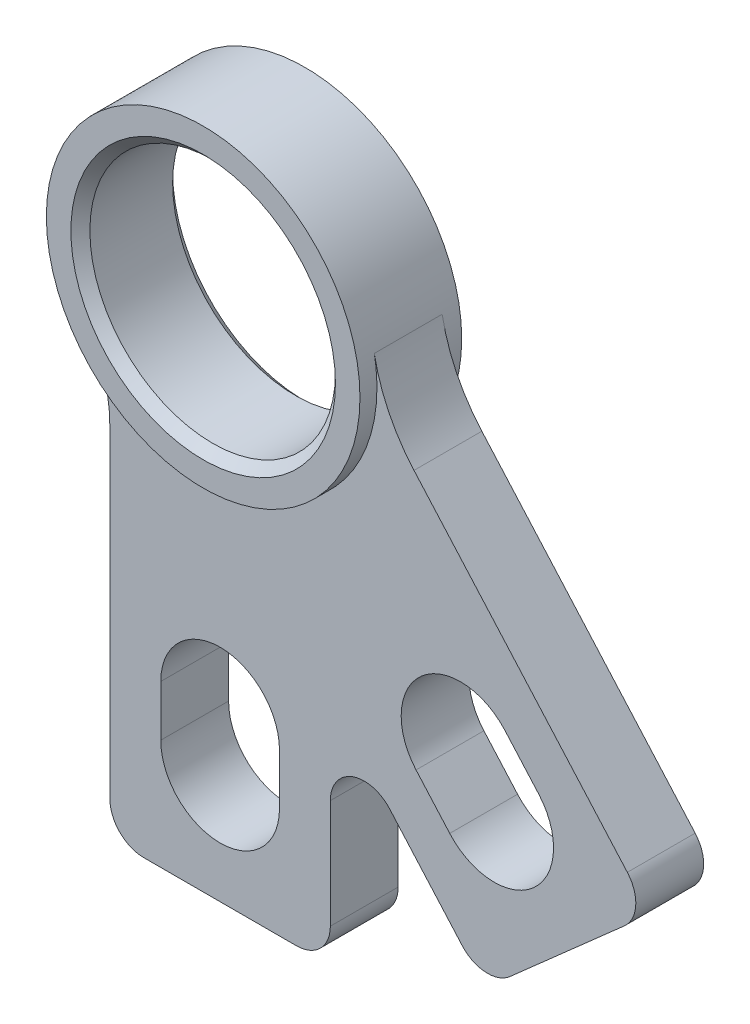
ISO-10303-21;
HEADER;
FILE_DESCRIPTION(('STEP AP214'),'2;1');
FILE_NAME('part.step','',(''),(''),'','','');
FILE_SCHEMA(('AUTOMOTIVE_DESIGN { 1 0 10303 214 1 1 1 1 }'));
ENDSEC;
DATA;
#1=APPLICATION_CONTEXT('core data for automotive mechanical design processes');
#2=APPLICATION_PROTOCOL_DEFINITION('international standard','automotive_design',2000,#1);
#3=PRODUCT_CONTEXT('',#1,'mechanical');
#4=PRODUCT('Part','Part','',(#3));
#5=PRODUCT_RELATED_PRODUCT_CATEGORY('part','',(#4));
#6=PRODUCT_DEFINITION_FORMATION('','',#4);
#7=PRODUCT_DEFINITION_CONTEXT('part definition',#1,'design');
#8=PRODUCT_DEFINITION('design','',#6,#7);
#9=PRODUCT_DEFINITION_SHAPE('','',#8);
#10=(LENGTH_UNIT() NAMED_UNIT(*) SI_UNIT(.MILLI.,.METRE.));
#11=(NAMED_UNIT(*) PLANE_ANGLE_UNIT() SI_UNIT($,.RADIAN.));
#12=(NAMED_UNIT(*) SI_UNIT($,.STERADIAN.) SOLID_ANGLE_UNIT());
#13=UNCERTAINTY_MEASURE_WITH_UNIT(LENGTH_MEASURE(1.E-05),#10,'distance_accuracy_value','');
#14=(GEOMETRIC_REPRESENTATION_CONTEXT(3) GLOBAL_UNCERTAINTY_ASSIGNED_CONTEXT((#13)) GLOBAL_UNIT_ASSIGNED_CONTEXT((#10,
#11,#12)) REPRESENTATION_CONTEXT('',''));
#15=CARTESIAN_POINT('',(0.,0.,0.));
#16=DIRECTION('',(0.,0.,1.));
#17=DIRECTION('',(1.,0.,0.));
#18=AXIS2_PLACEMENT_3D('',#15,#16,#17);
#19=CARTESIAN_POINT('',(0.,0.,4.7625));
#20=DIRECTION('',(0.,0.,-1.));
#21=DIRECTION('',(-1.,0.,0.));
#22=AXIS2_PLACEMENT_3D('',#19,#20,#21);
#23=CYLINDRICAL_SURFACE('',#22,11.495405);
#24=CARTESIAN_POINT('',(0.,0.,3.87349999999999));
#25=DIRECTION('',(0.,0.,1.));
#26=DIRECTION('',(1.,0.,0.));
#27=AXIS2_PLACEMENT_3D('',#24,#25,#26);
#28=CIRCLE('',#27,11.495405);
#29=CARTESIAN_POINT('',(-11.495405,0.,3.87349999999999));
#30=VERTEX_POINT('',#29);
#31=EDGE_CURVE('E376',#30,#30,#28,.T.);
#32=CARTESIAN_POINT('',(0.,0.,-3.87350000000005));
#33=DIRECTION('',(0.,0.,1.));
#34=DIRECTION('',(1.,0.,0.));
#35=AXIS2_PLACEMENT_3D('',#32,#33,#34);
#36=CIRCLE('',#35,11.495405);
#37=CARTESIAN_POINT('',(-11.495405,0.,-3.87350000000005));
#38=VERTEX_POINT('',#37);
#39=EDGE_CURVE('E373',#38,#38,#36,.F.);
#40=CARTESIAN_POINT('',(-11.495405,0.,3.87349999999999));
#41=CARTESIAN_POINT('',(-11.495405,0.,3.79280208333332));
#42=CARTESIAN_POINT('',(-11.495405,0.,3.71210416666666));
#43=CARTESIAN_POINT('',(-11.495405,0.,3.55070833333332));
#44=CARTESIAN_POINT('',(-11.495405,0.,3.47001041666665));
#45=CARTESIAN_POINT('',(-11.495405,0.,3.30861458333332));
#46=CARTESIAN_POINT('',(-11.495405,0.,3.22791666666665));
#47=CARTESIAN_POINT('',(-11.495405,0.,3.06652083333332));
#48=CARTESIAN_POINT('',(-11.495405,0.,2.98582291666665));
#49=CARTESIAN_POINT('',(-11.495405,0.,2.82442708333332));
#50=CARTESIAN_POINT('',(-11.495405,0.,2.74372916666665));
#51=CARTESIAN_POINT('',(-11.495405,0.,2.58233333333332));
#52=CARTESIAN_POINT('',(-11.495405,0.,2.50163541666665));
#53=CARTESIAN_POINT('',(-11.495405,0.,2.34023958333332));
#54=CARTESIAN_POINT('',(-11.495405,0.,2.25954166666665));
#55=CARTESIAN_POINT('',(-11.495405,0.,2.09814583333331));
#56=CARTESIAN_POINT('',(-11.495405,0.,2.01744791666665));
#57=CARTESIAN_POINT('',(-11.495405,0.,1.85605208333331));
#58=CARTESIAN_POINT('',(-11.495405,0.,1.77535416666665));
#59=CARTESIAN_POINT('',(-11.495405,0.,1.61395833333331));
#60=CARTESIAN_POINT('',(-11.495405,0.,1.53326041666664));
#61=CARTESIAN_POINT('',(-11.495405,0.,1.37186458333331));
#62=CARTESIAN_POINT('',(-11.495405,0.,1.29116666666664));
#63=CARTESIAN_POINT('',(-11.495405,0.,1.12977083333331));
#64=CARTESIAN_POINT('',(-11.495405,0.,1.04907291666664));
#65=CARTESIAN_POINT('',(-11.495405,0.,0.887677083333308));
#66=CARTESIAN_POINT('',(-11.495405,0.,0.80697916666664));
#67=CARTESIAN_POINT('',(-11.495405,0.,0.645583333333307));
#68=CARTESIAN_POINT('',(-11.495405,0.,0.564885416666639));
#69=CARTESIAN_POINT('',(-11.495405,0.,0.403489583333305));
#70=CARTESIAN_POINT('',(-11.495405,0.,0.322791666666638));
#71=CARTESIAN_POINT('',(-11.495405,0.,0.161395833333303));
#72=CARTESIAN_POINT('',(-11.495405,0.,0.080697916666636));
#73=CARTESIAN_POINT('',(-11.495405,0.,-0.0806979166666979));
#74=CARTESIAN_POINT('',(-11.495405,0.,-0.161395833333365));
#75=CARTESIAN_POINT('',(-11.495405,0.,-0.322791666666699));
#76=CARTESIAN_POINT('',(-11.495405,0.,-0.403489583333366));
#77=CARTESIAN_POINT('',(-11.495405,0.,-0.5648854166667));
#78=CARTESIAN_POINT('',(-11.495405,0.,-0.645583333333368));
#79=CARTESIAN_POINT('',(-11.495405,0.,-0.806979166666702));
#80=CARTESIAN_POINT('',(-11.495405,0.,-0.88767708333337));
#81=CARTESIAN_POINT('',(-11.495405,0.,-1.0490729166667));
#82=CARTESIAN_POINT('',(-11.495405,0.,-1.12977083333337));
#83=CARTESIAN_POINT('',(-11.495405,0.,-1.2911666666667));
#84=CARTESIAN_POINT('',(-11.495405,0.,-1.37186458333337));
#85=CARTESIAN_POINT('',(-11.495405,0.,-1.53326041666671));
#86=CARTESIAN_POINT('',(-11.495405,0.,-1.61395833333337));
#87=CARTESIAN_POINT('',(-11.495405,0.,-1.77535416666671));
#88=CARTESIAN_POINT('',(-11.495405,0.,-1.85605208333337));
#89=CARTESIAN_POINT('',(-11.495405,0.,-2.01744791666671));
#90=CARTESIAN_POINT('',(-11.495405,0.,-2.09814583333338));
#91=CARTESIAN_POINT('',(-11.495405,0.,-2.25954166666671));
#92=CARTESIAN_POINT('',(-11.495405,0.,-2.34023958333338));
#93=CARTESIAN_POINT('',(-11.495405,0.,-2.50163541666671));
#94=CARTESIAN_POINT('',(-11.495405,0.,-2.58233333333338));
#95=CARTESIAN_POINT('',(-11.495405,0.,-2.74372916666671));
#96=CARTESIAN_POINT('',(-11.495405,0.,-2.82442708333338));
#97=CARTESIAN_POINT('',(-11.495405,0.,-2.98582291666671));
#98=CARTESIAN_POINT('',(-11.495405,0.,-3.06652083333338));
#99=CARTESIAN_POINT('',(-11.495405,0.,-3.22791666666671));
#100=CARTESIAN_POINT('',(-11.495405,0.,-3.30861458333338));
#101=CARTESIAN_POINT('',(-11.495405,0.,-3.47001041666672));
#102=CARTESIAN_POINT('',(-11.495405,0.,-3.55070833333338));
#103=CARTESIAN_POINT('',(-11.495405,0.,-3.71210416666672));
#104=CARTESIAN_POINT('',(-11.495405,0.,-3.79280208333339));
#105=CARTESIAN_POINT('',(-11.495405,0.,-3.87350000000005));
#106=B_SPLINE_CURVE_WITH_KNOTS('',3,(#40,#41,#42,#43,#44,#45,#46,#47,#48,#49,#50,#51,#52,#53,
#54,#55,#56,#57,#58,#59,#60,#61,#62,#63,#64,#65,#66,#67,#68,#69,#70,#71,#72,#73,#74,#75,#76,#77,
#78,#79,#80,#81,#82,#83,#84,#85,#86,#87,#88,#89,#90,#91,#92,#93,#94,#95,#96,#97,#98,#99,#100,
#101,#102,#103,#104,#105),.UNSPECIFIED.,.F.,.F.,(4,2,2,2,2,2,2,2,2,2,2,2,2,2,2,2,2,2,2,2,2,2,2,
2,2,2,2,2,2,2,2,2,4),(0.,0.242093750000001,0.484187500000002,0.726281250000004,
0.968375000000005,1.21046875000001,1.45256250000001,1.69465625000001,1.93675000000001,
2.17884375000001,2.42093750000001,2.66303125000001,2.90512500000002,3.14721875000002,
3.38931250000002,3.63140625000002,3.87350000000002,4.11559375000002,4.35768750000002,
4.59978125000003,4.84187500000003,5.08396875000003,5.32606250000003,5.56815625000003,
5.81025000000003,6.05234375000003,6.29443750000003,6.53653125000004,6.77862500000004,
7.02071875000004,7.26281250000004,7.50490625000004,7.74700000000004),.UNSPECIFIED.);
#107=EDGE_CURVE('BSEAM39',#30,#38,#106,.T.);
#108=ORIENTED_EDGE('',*,*,#31,.T.);
#109=ORIENTED_EDGE('',*,*,#39,.T.);
#110=ORIENTED_EDGE('',*,*,#107,.T.);
#111=ORIENTED_EDGE('',*,*,#107,.F.);
#112=EDGE_LOOP('',(#108,#110,#109,#111));
#113=FACE_BOUND('',#112,.T.);
#114=ADVANCED_FACE('F39',(#113),#23,.F.);
#115=CARTESIAN_POINT('',(0.,0.,4.7625));
#116=DIRECTION('',(0.,0.,-1.));
#117=DIRECTION('',(-1.,0.,0.));
#118=AXIS2_PLACEMENT_3D('',#115,#116,#117);
#119=CYLINDRICAL_SURFACE('',#118,14.6812);
#120=DIRECTION('',(0.,0.,-1.));
#121=VECTOR('',#120,1.);
#122=CARTESIAN_POINT('',(-12.585193266832,-7.55979787272702,3.175));
#123=LINE('',#122,#121);
#124=CARTESIAN_POINT('',(-12.5851932668321,-7.55979787272669,3.175));
#125=VERTEX_POINT('',#124);
#126=CARTESIAN_POINT('',(-12.585193266832,-7.55979787272702,-3.175));
#127=VERTEX_POINT('',#126);
#128=EDGE_CURVE('E203',#125,#127,#123,.T.);
#129=ORIENTED_EDGE('',*,*,#128,.F.);
#130=CARTESIAN_POINT('',(0.,0.,3.175));
#131=DIRECTION('',(0.,0.,1.));
#132=DIRECTION('',(1.,0.,0.));
#133=AXIS2_PLACEMENT_3D('',#130,#131,#132);
#134=CIRCLE('',#133,14.6812);
#135=CARTESIAN_POINT('',(14.4367287096374,2.66805127468244,3.175));
#136=VERTEX_POINT('',#135);
#137=EDGE_CURVE('E219',#125,#136,#134,.T.);
#138=ORIENTED_EDGE('',*,*,#137,.T.);
#139=DIRECTION('',(0.,0.,-1.));
#140=VECTOR('',#139,1.);
#141=CARTESIAN_POINT('',(14.4367287096373,2.66805127468242,3.175));
#142=LINE('',#141,#140);
#143=CARTESIAN_POINT('',(14.4367287096373,2.66805127468242,-3.175));
#144=VERTEX_POINT('',#143);
#145=EDGE_CURVE('E259',#136,#144,#142,.T.);
#146=ORIENTED_EDGE('',*,*,#145,.T.);
#147=CARTESIAN_POINT('',(0.,0.,-3.175));
#148=DIRECTION('',(0.,0.,1.));
#149=DIRECTION('',(1.,0.,0.));
#150=AXIS2_PLACEMENT_3D('',#147,#148,#149);
#151=CIRCLE('',#150,14.6812);
#152=EDGE_CURVE('E260',#127,#144,#151,.T.);
#153=ORIENTED_EDGE('',*,*,#152,.F.);
#154=EDGE_LOOP('',(#129,#138,#146,#153));
#155=FACE_BOUND('',#154,.T.);
#156=CARTESIAN_POINT('',(0.,0.,4.7625));
#157=DIRECTION('',(0.,0.,1.));
#158=DIRECTION('',(1.,0.,0.));
#159=AXIS2_PLACEMENT_3D('',#156,#157,#158);
#160=CIRCLE('',#159,14.6812);
#161=CARTESIAN_POINT('',(14.6812,0.,4.7625));
#162=VERTEX_POINT('',#161);
#163=EDGE_CURVE('E326',#162,#162,#160,.T.);
#164=ORIENTED_EDGE('',*,*,#163,.F.);
#165=EDGE_LOOP('',(#164));
#166=FACE_BOUND('',#165,.T.);
#167=CARTESIAN_POINT('',(0.,0.,-4.7625));
#168=DIRECTION('',(0.,0.,1.));
#169=DIRECTION('',(1.,0.,0.));
#170=AXIS2_PLACEMENT_3D('',#167,#168,#169);
#171=CIRCLE('',#170,14.6812);
#172=CARTESIAN_POINT('',(14.6812,0.,-4.7625));
#173=VERTEX_POINT('',#172);
#174=EDGE_CURVE('E314',#173,#173,#171,.T.);
#175=ORIENTED_EDGE('',*,*,#174,.T.);
#176=EDGE_LOOP('',(#175));
#177=FACE_BOUND('',#176,.T.);
#178=ADVANCED_FACE('F392',(#155,#166,#177),#119,.T.);
#179=CARTESIAN_POINT('',(0.,0.,4.7625));
#180=DIRECTION('',(0.,0.,1.));
#181=DIRECTION('',(1.,0.,0.));
#182=AXIS2_PLACEMENT_3D('',#179,#180,#181);
#183=PLANE('',#182);
#184=CARTESIAN_POINT('',(0.,0.,4.7625));
#185=DIRECTION('',(0.,0.,1.));
#186=DIRECTION('',(1.,0.,0.));
#187=AXIS2_PLACEMENT_3D('',#184,#185,#186);
#188=CIRCLE('',#187,12.384405);
#189=CARTESIAN_POINT('',(12.384405,0.,4.7625));
#190=VERTEX_POINT('',#189);
#191=EDGE_CURVE('E48',#190,#190,#188,.F.);
#192=ORIENTED_EDGE('',*,*,#191,.T.);
#193=EDGE_LOOP('',(#192));
#194=FACE_BOUND('',#193,.T.);
#195=ORIENTED_EDGE('',*,*,#163,.T.);
#196=EDGE_LOOP('',(#195));
#197=FACE_BOUND('',#196,.T.);
#198=ADVANCED_FACE('F381',(#194,#197),#183,.T.);
#199=CARTESIAN_POINT('',(0.,0.,-4.7625));
#200=DIRECTION('',(0.,0.,1.));
#201=DIRECTION('',(1.,0.,0.));
#202=AXIS2_PLACEMENT_3D('',#199,#200,#201);
#203=PLANE('',#202);
#204=CARTESIAN_POINT('',(0.,0.,-4.7625));
#205=DIRECTION('',(0.,0.,1.));
#206=DIRECTION('',(1.,0.,0.));
#207=AXIS2_PLACEMENT_3D('',#204,#205,#206);
#208=CIRCLE('',#207,12.3844049999999);
#209=CARTESIAN_POINT('',(-12.3844049999999,0.,-4.7625));
#210=VERTEX_POINT('',#209);
#211=EDGE_CURVE('E11',#210,#210,#208,.T.);
#212=ORIENTED_EDGE('',*,*,#211,.T.);
#213=EDGE_LOOP('',(#212));
#214=FACE_BOUND('',#213,.T.);
#215=ORIENTED_EDGE('',*,*,#174,.F.);
#216=EDGE_LOOP('',(#215));
#217=FACE_BOUND('',#216,.T.);
#218=ADVANCED_FACE('F400',(#214,#217),#203,.F.);
#219=CARTESIAN_POINT('',(0.,-33.9270697939259,3.175));
#220=DIRECTION('',(0.,0.,-1.));
#221=DIRECTION('',(-1.,0.,0.));
#222=AXIS2_PLACEMENT_3D('',#219,#220,#221);
#223=CYLINDRICAL_SURFACE('',#222,5.55624999999851);
#224=CARTESIAN_POINT('',(0.,-33.9270697939259,-3.175));
#225=DIRECTION('',(0.,0.,1.));
#226=DIRECTION('',(1.,0.,0.));
#227=AXIS2_PLACEMENT_3D('',#224,#225,#226);
#228=CIRCLE('',#227,5.55624999999851);
#229=CARTESIAN_POINT('',(5.55624999999857,-33.9270697939259,-3.175));
#230=VERTEX_POINT('',#229);
#231=CARTESIAN_POINT('',(-5.55624999999845,-33.9270697939259,-3.175));
#232=VERTEX_POINT('',#231);
#233=EDGE_CURVE('E294',#230,#232,#228,.T.);
#234=ORIENTED_EDGE('',*,*,#233,.F.);
#235=DIRECTION('',(0.,0.,-1.));
#236=VECTOR('',#235,1.);
#237=CARTESIAN_POINT('',(5.55624999999857,-33.9270697939259,3.175));
#238=LINE('',#237,#236);
#239=CARTESIAN_POINT('',(5.55624999999857,-33.9270697939259,3.175));
#240=VERTEX_POINT('',#239);
#241=EDGE_CURVE('E312',#240,#230,#238,.T.);
#242=ORIENTED_EDGE('',*,*,#241,.F.);
#243=CARTESIAN_POINT('',(0.,-33.9270697939259,3.175));
#244=DIRECTION('',(0.,0.,1.));
#245=DIRECTION('',(1.,0.,0.));
#246=AXIS2_PLACEMENT_3D('',#243,#244,#245);
#247=CIRCLE('',#246,5.55624999999851);
#248=CARTESIAN_POINT('',(-5.55624999999845,-33.9270697939259,3.175));
#249=VERTEX_POINT('',#248);
#250=EDGE_CURVE('E248',#240,#249,#247,.T.);
#251=ORIENTED_EDGE('',*,*,#250,.T.);
#252=DIRECTION('',(0.,0.,-1.));
#253=VECTOR('',#252,1.);
#254=CARTESIAN_POINT('',(-5.55624999999845,-33.9270697939259,3.175));
#255=LINE('',#254,#253);
#256=EDGE_CURVE('E305',#249,#232,#255,.T.);
#257=ORIENTED_EDGE('',*,*,#256,.T.);
#258=EDGE_LOOP('',(#234,#242,#251,#257));
#259=FACE_BOUND('',#258,.T.);
#260=ADVANCED_FACE('F403',(#259),#223,.F.);
#261=CARTESIAN_POINT('',(5.55624999999857,0.,3.175));
#262=DIRECTION('',(-1.,0.,0.));
#263=DIRECTION('',(0.,0.,1.));
#264=AXIS2_PLACEMENT_3D('',#261,#262,#263);
#265=PLANE('',#264);
#266=DIRECTION('',(0.,1.,0.));
#267=VECTOR('',#266,1.);
#268=CARTESIAN_POINT('',(5.55624999999857,0.,-3.175));
#269=LINE('',#268,#267);
#270=CARTESIAN_POINT('',(5.55624999999857,-38.6895697939291,-3.175));
#271=VERTEX_POINT('',#270);
#272=EDGE_CURVE('E297',#271,#230,#269,.T.);
#273=ORIENTED_EDGE('',*,*,#272,.F.);
#274=DIRECTION('',(0.,0.,-1.));
#275=VECTOR('',#274,1.);
#276=CARTESIAN_POINT('',(5.55624999999857,-38.6895697939291,3.175));
#277=LINE('',#276,#275);
#278=CARTESIAN_POINT('',(5.55624999999857,-38.6895697939291,3.175));
#279=VERTEX_POINT('',#278);
#280=EDGE_CURVE('E310',#279,#271,#277,.T.);
#281=ORIENTED_EDGE('',*,*,#280,.F.);
#282=DIRECTION('',(0.,1.,0.));
#283=VECTOR('',#282,1.);
#284=CARTESIAN_POINT('',(5.55624999999857,0.,3.175));
#285=LINE('',#284,#283);
#286=EDGE_CURVE('E251',#279,#240,#285,.T.);
#287=ORIENTED_EDGE('',*,*,#286,.T.);
#288=ORIENTED_EDGE('',*,*,#241,.T.);
#289=EDGE_LOOP('',(#273,#281,#287,#288));
#290=FACE_BOUND('',#289,.T.);
#291=ADVANCED_FACE('F546',(#290),#265,.T.);
#292=CARTESIAN_POINT('',(0.,-38.6895697939291,3.175));
#293=DIRECTION('',(0.,0.,-1.));
#294=DIRECTION('',(-1.,0.,0.));
#295=AXIS2_PLACEMENT_3D('',#292,#293,#294);
#296=CYLINDRICAL_SURFACE('',#295,5.55624999999851);
#297=CARTESIAN_POINT('',(0.,-38.6895697939291,-3.175));
#298=DIRECTION('',(0.,0.,1.));
#299=DIRECTION('',(1.,0.,0.));
#300=AXIS2_PLACEMENT_3D('',#297,#298,#299);
#301=CIRCLE('',#300,5.55624999999851);
#302=CARTESIAN_POINT('',(-5.55624999999845,-38.6895697939291,-3.175));
#303=VERTEX_POINT('',#302);
#304=EDGE_CURVE('E300',#303,#271,#301,.T.);
#305=ORIENTED_EDGE('',*,*,#304,.F.);
#306=DIRECTION('',(0.,0.,-1.));
#307=VECTOR('',#306,1.);
#308=CARTESIAN_POINT('',(-5.55624999999845,-38.6895697939291,3.175));
#309=LINE('',#308,#307);
#310=CARTESIAN_POINT('',(-5.55624999999845,-38.6895697939291,3.175));
#311=VERTEX_POINT('',#310);
#312=EDGE_CURVE('E307',#311,#303,#309,.T.);
#313=ORIENTED_EDGE('',*,*,#312,.F.);
#314=CARTESIAN_POINT('',(0.,-38.6895697939291,3.175));
#315=DIRECTION('',(0.,0.,1.));
#316=DIRECTION('',(1.,0.,0.));
#317=AXIS2_PLACEMENT_3D('',#314,#315,#316);
#318=CIRCLE('',#317,5.55624999999851);
#319=EDGE_CURVE('E254',#311,#279,#318,.T.);
#320=ORIENTED_EDGE('',*,*,#319,.T.);
#321=ORIENTED_EDGE('',*,*,#280,.T.);
#322=EDGE_LOOP('',(#305,#313,#320,#321));
#323=FACE_BOUND('',#322,.T.);
#324=ADVANCED_FACE('F513',(#323),#296,.F.);
#325=CARTESIAN_POINT('',(22.5066110277093,-25.4717744761362,3.175));
#326=DIRECTION('',(0.,0.,-1.));
#327=DIRECTION('',(-1.,0.,0.));
#328=AXIS2_PLACEMENT_3D('',#325,#326,#327);
#329=CYLINDRICAL_SURFACE('',#328,5.5562499999984);
#330=CARTESIAN_POINT('',(22.5066110277093,-25.4717744761362,-3.175));
#331=DIRECTION('',(0.,0.,1.));
#332=DIRECTION('',(1.,0.,0.));
#333=AXIS2_PLACEMENT_3D('',#330,#331,#332);
#334=CIRCLE('',#333,5.5562499999984);
#335=CARTESIAN_POINT('',(26.6703407854341,-21.7927435484163,-3.175));
#336=VERTEX_POINT('',#335);
#337=CARTESIAN_POINT('',(18.3428812699846,-29.150805403856,-3.175));
#338=VERTEX_POINT('',#337);
#339=EDGE_CURVE('E282',#336,#338,#334,.T.);
#340=ORIENTED_EDGE('',*,*,#339,.F.);
#341=DIRECTION('',(0.,0.,-1.));
#342=VECTOR('',#341,1.);
#343=CARTESIAN_POINT('',(26.6703407854341,-21.7927435484163,3.175));
#344=LINE('',#343,#342);
#345=CARTESIAN_POINT('',(26.6703407854341,-21.7927435484163,3.175));
#346=VERTEX_POINT('',#345);
#347=EDGE_CURVE('E308',#346,#336,#344,.T.);
#348=ORIENTED_EDGE('',*,*,#347,.F.);
#349=CARTESIAN_POINT('',(22.5066110277093,-25.4717744761362,3.175));
#350=DIRECTION('',(0.,0.,1.));
#351=DIRECTION('',(1.,0.,0.));
#352=AXIS2_PLACEMENT_3D('',#349,#350,#351);
#353=CIRCLE('',#352,5.5562499999984);
#354=CARTESIAN_POINT('',(18.3428812699846,-29.150805403856,3.175));
#355=VERTEX_POINT('',#354);
#356=EDGE_CURVE('E237',#346,#355,#353,.T.);
#357=ORIENTED_EDGE('',*,*,#356,.T.);
#358=DIRECTION('',(0.,0.,-1.));
#359=VECTOR('',#358,1.);
#360=CARTESIAN_POINT('',(18.3428812699846,-29.150805403856,3.175));
#361=LINE('',#360,#359);
#362=EDGE_CURVE('E315',#355,#338,#361,.T.);
#363=ORIENTED_EDGE('',*,*,#362,.T.);
#364=EDGE_LOOP('',(#340,#348,#357,#363));
#365=FACE_BOUND('',#364,.T.);
#366=ADVANCED_FACE('F505',(#365),#329,.F.);
#367=CARTESIAN_POINT('',(4.16372975772487,3.67903092771991,3.175));
#368=DIRECTION('',(-0.749377684180158,-0.662142799139871,0.));
#369=DIRECTION('',(0.662142799139871,-0.749377684180158,0.));
#370=AXIS2_PLACEMENT_3D('',#367,#368,#369);
#371=PLANE('',#370);
#372=DIRECTION('',(-0.662142799139871,0.749377684180158,0.));
#373=VECTOR('',#372,1.);
#374=CARTESIAN_POINT('',(4.16372975772487,3.67903092771991,-3.175));
#375=LINE('',#374,#373);
#376=CARTESIAN_POINT('',(29.8237958663399,-25.3616547693267,-3.175));
#377=VERTEX_POINT('',#376);
#378=EDGE_CURVE('E285',#377,#336,#375,.T.);
#379=ORIENTED_EDGE('',*,*,#378,.F.);
#380=DIRECTION('',(0.,0.,-1.));
#381=VECTOR('',#380,1.);
#382=CARTESIAN_POINT('',(29.8237958663399,-25.3616547693267,3.175));
#383=LINE('',#382,#381);
#384=CARTESIAN_POINT('',(29.8237958663399,-25.3616547693267,3.175));
#385=VERTEX_POINT('',#384);
#386=EDGE_CURVE('E319',#385,#377,#383,.T.);
#387=ORIENTED_EDGE('',*,*,#386,.F.);
#388=DIRECTION('',(-0.662142799139871,0.749377684180158,0.));
#389=VECTOR('',#388,1.);
#390=CARTESIAN_POINT('',(4.16372975772487,3.67903092771991,3.175));
#391=LINE('',#390,#389);
#392=EDGE_CURVE('E240',#385,#346,#391,.T.);
#393=ORIENTED_EDGE('',*,*,#392,.T.);
#394=ORIENTED_EDGE('',*,*,#347,.T.);
#395=EDGE_LOOP('',(#379,#387,#393,#394));
#396=FACE_BOUND('',#395,.T.);
#397=ADVANCED_FACE('F499',(#396),#371,.T.);
#398=CARTESIAN_POINT('',(25.6600661086151,-29.0406856970466,3.175));
#399=DIRECTION('',(0.,0.,-1.));
#400=DIRECTION('',(-1.,0.,0.));
#401=AXIS2_PLACEMENT_3D('',#398,#399,#400);
#402=CYLINDRICAL_SURFACE('',#401,5.5562499999984);
#403=CARTESIAN_POINT('',(25.6600661086151,-29.0406856970466,-3.175));
#404=DIRECTION('',(0.,0.,1.));
#405=DIRECTION('',(1.,0.,0.));
#406=AXIS2_PLACEMENT_3D('',#403,#404,#405);
#407=CIRCLE('',#406,5.5562499999984);
#408=CARTESIAN_POINT('',(21.4963363508903,-32.7197166247664,-3.175));
#409=VERTEX_POINT('',#408);
#410=EDGE_CURVE('E288',#409,#377,#407,.T.);
#411=ORIENTED_EDGE('',*,*,#410,.F.);
#412=DIRECTION('',(0.,0.,-1.));
#413=VECTOR('',#412,1.);
#414=CARTESIAN_POINT('',(21.4963363508903,-32.7197166247664,3.175));
#415=LINE('',#414,#413);
#416=CARTESIAN_POINT('',(21.4963363508903,-32.7197166247664,3.175));
#417=VERTEX_POINT('',#416);
#418=EDGE_CURVE('E317',#417,#409,#415,.T.);
#419=ORIENTED_EDGE('',*,*,#418,.F.);
#420=CARTESIAN_POINT('',(25.6600661086151,-29.0406856970466,3.175));
#421=DIRECTION('',(0.,0.,1.));
#422=DIRECTION('',(1.,0.,0.));
#423=AXIS2_PLACEMENT_3D('',#420,#421,#422);
#424=CIRCLE('',#423,5.5562499999984);
#425=EDGE_CURVE('E243',#417,#385,#424,.T.);
#426=ORIENTED_EDGE('',*,*,#425,.T.);
#427=ORIENTED_EDGE('',*,*,#386,.T.);
#428=EDGE_LOOP('',(#411,#419,#426,#427));
#429=FACE_BOUND('',#428,.T.);
#430=ADVANCED_FACE('F495',(#429),#402,.F.);
#431=CARTESIAN_POINT('',(-26.193749999998,-15.7343197939275,3.175));
#432=DIRECTION('',(0.,0.,-1.));
#433=DIRECTION('',(-1.,0.,0.));
#434=AXIS2_PLACEMENT_3D('',#431,#432,#433);
#435=CYLINDRICAL_SURFACE('',#434,15.8749999999996);
#436=CARTESIAN_POINT('',(-26.193749999998,-15.7343197939275,-3.175));
#437=DIRECTION('',(0.,0.,1.));
#438=DIRECTION('',(1.,0.,0.));
#439=AXIS2_PLACEMENT_3D('',#436,#437,#438);
#440=CIRCLE('',#439,15.8749999999996);
#441=CARTESIAN_POINT('',(-10.3187499999984,-15.7343197939275,-3.175));
#442=VERTEX_POINT('',#441);
#443=EDGE_CURVE('E199',#442,#127,#440,.T.);
#444=ORIENTED_EDGE('',*,*,#443,.F.);
#445=DIRECTION('',(0.,0.,-1.));
#446=VECTOR('',#445,1.);
#447=CARTESIAN_POINT('',(-10.3187499999984,-15.7343197939275,3.175));
#448=LINE('',#447,#446);
#449=CARTESIAN_POINT('',(-10.3187499999984,-15.7343197939275,3.175));
#450=VERTEX_POINT('',#449);
#451=EDGE_CURVE('E192',#450,#442,#448,.T.);
#452=ORIENTED_EDGE('',*,*,#451,.F.);
#453=CARTESIAN_POINT('',(-26.193749999998,-15.7343197939275,3.175));
#454=DIRECTION('',(0.,0.,1.));
#455=DIRECTION('',(1.,0.,0.));
#456=AXIS2_PLACEMENT_3D('',#453,#454,#455);
#457=CIRCLE('',#456,15.8749999999996);
#458=EDGE_CURVE('E197',#450,#125,#457,.T.);
#459=ORIENTED_EDGE('',*,*,#458,.T.);
#460=ORIENTED_EDGE('',*,*,#128,.T.);
#461=EDGE_LOOP('',(#444,#452,#459,#460));
#462=FACE_BOUND('',#461,.T.);
#463=ADVANCED_FACE('F194',(#462),#435,.F.);
#464=CARTESIAN_POINT('',(-10.3187499999984,0.,3.175));
#465=DIRECTION('',(1.,0.,0.));
#466=DIRECTION('',(0.,1.,0.));
#467=AXIS2_PLACEMENT_3D('',#464,#465,#466);
#468=PLANE('',#467);
#469=DIRECTION('',(0.,-1.,0.));
#470=VECTOR('',#469,1.);
#471=CARTESIAN_POINT('',(-10.3187499999984,0.,-3.175));
#472=LINE('',#471,#470);
#473=CARTESIAN_POINT('',(-10.3187499999984,-45.8333197939275,-3.175));
#474=VERTEX_POINT('',#473);
#475=EDGE_CURVE('E264',#442,#474,#472,.T.);
#476=ORIENTED_EDGE('',*,*,#475,.T.);
#477=DIRECTION('',(0.,0.,-1.));
#478=VECTOR('',#477,1.);
#479=CARTESIAN_POINT('',(-10.3187499999984,-45.8333197939275,3.175));
#480=LINE('',#479,#478);
#481=CARTESIAN_POINT('',(-10.3187499999984,-45.8333197939275,3.175));
#482=VERTEX_POINT('',#481);
#483=EDGE_CURVE('E210',#474,#482,#480,.F.);
#484=ORIENTED_EDGE('',*,*,#483,.T.);
#485=DIRECTION('',(0.,-1.,0.));
#486=VECTOR('',#485,1.);
#487=CARTESIAN_POINT('',(-10.3187499999984,0.,3.175));
#488=LINE('',#487,#486);
#489=EDGE_CURVE('E207',#450,#482,#488,.T.);
#490=ORIENTED_EDGE('',*,*,#489,.F.);
#491=ORIENTED_EDGE('',*,*,#451,.T.);
#492=EDGE_LOOP('',(#476,#484,#490,#491));
#493=FACE_BOUND('',#492,.T.);
#494=ADVANCED_FACE('F208',(#493),#468,.F.);
#495=CARTESIAN_POINT('',(0.,-49.0083197939275,3.175));
#496=DIRECTION('',(0.,1.,0.));
#497=DIRECTION('',(-1.,0.,0.));
#498=AXIS2_PLACEMENT_3D('',#495,#496,#497);
#499=PLANE('',#498);
#500=DIRECTION('',(1.,0.,0.));
#501=VECTOR('',#500,1.);
#502=CARTESIAN_POINT('',(0.,-49.0083197939275,-3.175));
#503=LINE('',#502,#501);
#504=CARTESIAN_POINT('',(-7.14374999999845,-49.0083197939275,-3.175));
#505=VERTEX_POINT('',#504);
#506=CARTESIAN_POINT('',(7.14374999999837,-49.0083197939275,-3.175));
#507=VERTEX_POINT('',#506);
#508=EDGE_CURVE('E266',#505,#507,#503,.T.);
#509=ORIENTED_EDGE('',*,*,#508,.T.);
#510=DIRECTION('',(0.,0.,-1.));
#511=VECTOR('',#510,1.);
#512=CARTESIAN_POINT('',(7.14374999999837,-49.0083197939275,3.175));
#513=LINE('',#512,#511);
#514=CARTESIAN_POINT('',(7.14374999999837,-49.0083197939275,3.175));
#515=VERTEX_POINT('',#514);
#516=EDGE_CURVE('E63',#507,#515,#513,.F.);
#517=ORIENTED_EDGE('',*,*,#516,.T.);
#518=DIRECTION('',(1.,0.,0.));
#519=VECTOR('',#518,1.);
#520=CARTESIAN_POINT('',(0.,-49.0083197939275,3.175));
#521=LINE('',#520,#519);
#522=CARTESIAN_POINT('',(-7.14374999999845,-49.0083197939275,3.175));
#523=VERTEX_POINT('',#522);
#524=EDGE_CURVE('E212',#523,#515,#521,.T.);
#525=ORIENTED_EDGE('',*,*,#524,.F.);
#526=DIRECTION('',(0.,0.,-1.));
#527=VECTOR('',#526,1.);
#528=CARTESIAN_POINT('',(-7.14374999999845,-49.0083197939275,3.175));
#529=LINE('',#528,#527);
#530=EDGE_CURVE('E361',#523,#505,#529,.T.);
#531=ORIENTED_EDGE('',*,*,#530,.T.);
#532=EDGE_LOOP('',(#509,#517,#525,#531));
#533=FACE_BOUND('',#532,.T.);
#534=ADVANCED_FACE('F459',(#533),#499,.F.);
#535=CARTESIAN_POINT('',(10.3187499999988,-1.01246102963548E-13,3.175));
#536=DIRECTION('',(-1.,0.,0.));
#537=DIRECTION('',(0.,-1.,0.));
#538=AXIS2_PLACEMENT_3D('',#535,#536,#537);
#539=PLANE('',#538);
#540=DIRECTION('',(0.,1.,0.));
#541=VECTOR('',#540,1.);
#542=CARTESIAN_POINT('',(10.3187499999988,-1.01246102963548E-13,-3.175));
#543=LINE('',#542,#541);
#544=CARTESIAN_POINT('',(10.3187499999984,-45.8333197939275,-3.175));
#545=VERTEX_POINT('',#544);
#546=CARTESIAN_POINT('',(10.3187499999985,-35.6504143163184,-3.175));
#547=VERTEX_POINT('',#546);
#548=EDGE_CURVE('E268',#545,#547,#543,.T.);
#549=ORIENTED_EDGE('',*,*,#548,.T.);
#550=DIRECTION('',(0.,0.,-1.));
#551=VECTOR('',#550,1.);
#552=CARTESIAN_POINT('',(10.3187499999985,-35.6504143163184,3.175));
#553=LINE('',#552,#551);
#554=CARTESIAN_POINT('',(10.3187499999985,-35.6504143163184,3.175));
#555=VERTEX_POINT('',#554);
#556=EDGE_CURVE('E339',#547,#555,#553,.F.);
#557=ORIENTED_EDGE('',*,*,#556,.T.);
#558=DIRECTION('',(0.,1.,0.));
#559=VECTOR('',#558,1.);
#560=CARTESIAN_POINT('',(10.3187499999988,-1.01246102963548E-13,3.175));
#561=LINE('',#560,#559);
#562=CARTESIAN_POINT('',(10.3187499999984,-45.8333197939275,3.175));
#563=VERTEX_POINT('',#562);
#564=EDGE_CURVE('E225',#563,#555,#561,.T.);
#565=ORIENTED_EDGE('',*,*,#564,.F.);
#566=DIRECTION('',(0.,0.,-1.));
#567=VECTOR('',#566,1.);
#568=CARTESIAN_POINT('',(10.3187499999984,-45.8333197939275,3.175));
#569=LINE('',#568,#567);
#570=EDGE_CURVE('E336',#563,#545,#569,.T.);
#571=ORIENTED_EDGE('',*,*,#570,.T.);
#572=EDGE_LOOP('',(#549,#557,#565,#571));
#573=FACE_BOUND('',#572,.T.);
#574=ADVANCED_FACE('F464',(#573),#539,.F.);
#575=CARTESIAN_POINT('',(-7.73264097863277,-6.83248600862346,3.175));
#576=DIRECTION('',(-0.749377684180158,-0.662142799139871,0.));
#577=DIRECTION('',(0.662142799139871,-0.749377684180158,0.));
#578=AXIS2_PLACEMENT_3D('',#575,#576,#577);
#579=PLANE('',#578);
#580=DIRECTION('',(-0.662142799139871,0.749377684180158,0.));
#581=VECTOR('',#580,1.);
#582=CARTESIAN_POINT('',(-7.73264097863277,-6.83248600862346,3.175));
#583=LINE('',#582,#581);
#584=CARTESIAN_POINT('',(22.6576077513366,-41.2265385370309,3.175));
#585=VERTEX_POINT('',#584);
#586=CARTESIAN_POINT('',(15.8730241472705,-33.5481109290493,3.175));
#587=VERTEX_POINT('',#586);
#588=EDGE_CURVE('E228',#585,#587,#583,.T.);
#589=ORIENTED_EDGE('',*,*,#588,.T.);
#590=DIRECTION('',(0.,0.,-1.));
#591=VECTOR('',#590,1.);
#592=CARTESIAN_POINT('',(15.8730241472705,-33.5481109290493,3.175));
#593=LINE('',#592,#591);
#594=CARTESIAN_POINT('',(15.8730241472705,-33.5481109290493,-3.175));
#595=VERTEX_POINT('',#594);
#596=EDGE_CURVE('E333',#587,#595,#593,.T.);
#597=ORIENTED_EDGE('',*,*,#596,.T.);
#598=DIRECTION('',(-0.662142799139871,0.749377684180158,0.));
#599=VECTOR('',#598,1.);
#600=CARTESIAN_POINT('',(-7.73264097863277,-6.83248600862346,-3.175));
#601=LINE('',#600,#599);
#602=CARTESIAN_POINT('',(22.6576077513366,-41.2265385370309,-3.175));
#603=VERTEX_POINT('',#602);
#604=EDGE_CURVE('E271',#603,#595,#601,.T.);
#605=ORIENTED_EDGE('',*,*,#604,.F.);
#606=DIRECTION('',(0.,0.,-1.));
#607=VECTOR('',#606,1.);
#608=CARTESIAN_POINT('',(22.6576077513366,-41.2265385370309,3.175));
#609=LINE('',#608,#607);
#610=EDGE_CURVE('E329',#603,#585,#609,.F.);
#611=ORIENTED_EDGE('',*,*,#610,.T.);
#612=EDGE_LOOP('',(#589,#597,#605,#611));
#613=FACE_BOUND('',#612,.T.);
#614=ADVANCED_FACE('F470',(#613),#579,.T.);
#615=CARTESIAN_POINT('',(32.4925521172385,-36.7733266756794,3.175));
#616=DIRECTION('',(-0.662142799139871,0.749377684180158,0.));
#617=DIRECTION('',(-0.749377684180158,-0.662142799139871,0.));
#618=AXIS2_PLACEMENT_3D('',#615,#616,#617);
#619=PLANE('',#618);
#620=DIRECTION('',(0.749377684180158,0.662142799139871,0.));
#621=VECTOR('',#620,1.);
#622=CARTESIAN_POINT('',(32.4925521172385,-36.7733266756794,3.175));
#623=LINE('',#622,#621);
#624=CARTESIAN_POINT('',(27.1391852858777,-41.5035092970338,3.175));
#625=VERTEX_POINT('',#624);
#626=CARTESIAN_POINT('',(37.8459189485994,-32.043144054325,3.175));
#627=VERTEX_POINT('',#626);
#628=EDGE_CURVE('E231',#625,#627,#623,.T.);
#629=ORIENTED_EDGE('',*,*,#628,.F.);
#630=DIRECTION('',(0.,0.,-1.));
#631=VECTOR('',#630,1.);
#632=CARTESIAN_POINT('',(27.1391852858777,-41.5035092970338,-3.175));
#633=LINE('',#632,#631);
#634=CARTESIAN_POINT('',(27.1391852858777,-41.5035092970338,-3.175));
#635=VERTEX_POINT('',#634);
#636=EDGE_CURVE('E343',#625,#635,#633,.T.);
#637=ORIENTED_EDGE('',*,*,#636,.T.);
#638=DIRECTION('',(0.749377684180158,0.662142799139871,0.));
#639=VECTOR('',#638,1.);
#640=CARTESIAN_POINT('',(32.4925521172385,-36.7733266756794,-3.175));
#641=LINE('',#640,#639);
#642=CARTESIAN_POINT('',(37.8459189485994,-32.043144054325,-3.175));
#643=VERTEX_POINT('',#642);
#644=EDGE_CURVE('E274',#635,#643,#641,.T.);
#645=ORIENTED_EDGE('',*,*,#644,.T.);
#646=DIRECTION('',(0.,0.,-1.));
#647=VECTOR('',#646,1.);
#648=CARTESIAN_POINT('',(37.8459189485994,-32.043144054325,3.175));
#649=LINE('',#648,#647);
#650=EDGE_CURVE('E341',#643,#627,#649,.F.);
#651=ORIENTED_EDGE('',*,*,#650,.T.);
#652=EDGE_LOOP('',(#629,#637,#645,#651));
#653=FACE_BOUND('',#652,.T.);
#654=ADVANCED_FACE('F476',(#653),#619,.F.);
#655=CARTESIAN_POINT('',(7.73264097863289,6.83248600862355,3.175));
#656=DIRECTION('',(-0.749377684180158,-0.662142799139871,0.));
#657=DIRECTION('',(0.662142799139871,-0.749377684180158,0.));
#658=AXIS2_PLACEMENT_3D('',#655,#656,#657);
#659=PLANE('',#658);
#660=DIRECTION('',(-0.662142799139871,0.749377684180158,0.));
#661=VECTOR('',#660,1.);
#662=CARTESIAN_POINT('',(7.73264097863289,6.83248600862355,3.175));
#663=LINE('',#662,#661);
#664=CARTESIAN_POINT('',(38.1228897086023,-27.5615665197839,3.175));
#665=VERTEX_POINT('',#664);
#666=CARTESIAN_POINT('',(18.1510075295463,-4.9584621207003,3.175));
#667=VERTEX_POINT('',#666);
#668=EDGE_CURVE('E233',#665,#667,#663,.T.);
#669=ORIENTED_EDGE('',*,*,#668,.F.);
#670=DIRECTION('',(0.,0.,-1.));
#671=VECTOR('',#670,1.);
#672=CARTESIAN_POINT('',(38.1228897086023,-27.5615665197839,3.175));
#673=LINE('',#672,#671);
#674=CARTESIAN_POINT('',(38.1228897086023,-27.5615665197839,-3.175));
#675=VERTEX_POINT('',#674);
#676=EDGE_CURVE('E366',#665,#675,#673,.T.);
#677=ORIENTED_EDGE('',*,*,#676,.T.);
#678=DIRECTION('',(-0.662142799139871,0.749377684180158,0.));
#679=VECTOR('',#678,1.);
#680=CARTESIAN_POINT('',(7.73264097863289,6.83248600862355,-3.175));
#681=LINE('',#680,#679);
#682=CARTESIAN_POINT('',(18.1510075295463,-4.9584621207003,-3.175));
#683=VERTEX_POINT('',#682);
#684=EDGE_CURVE('E277',#675,#683,#681,.T.);
#685=ORIENTED_EDGE('',*,*,#684,.T.);
#686=DIRECTION('',(0.,0.,-1.));
#687=VECTOR('',#686,1.);
#688=CARTESIAN_POINT('',(18.1510075295463,-4.9584621207003,3.175));
#689=LINE('',#688,#687);
#690=EDGE_CURVE('E204',#667,#683,#689,.T.);
#691=ORIENTED_EDGE('',*,*,#690,.F.);
#692=EDGE_LOOP('',(#669,#677,#685,#691));
#693=FACE_BOUND('',#692,.T.);
#694=ADVANCED_FACE('F446',(#693),#659,.F.);
#695=CARTESIAN_POINT('',(-4.16372975772473,-3.67903092771979,3.175));
#696=DIRECTION('',(-0.749377684180158,-0.662142799139871,0.));
#697=DIRECTION('',(0.662142799139871,-0.749377684180158,0.));
#698=AXIS2_PLACEMENT_3D('',#695,#696,#697);
#699=PLANE('',#698);
#700=DIRECTION('',(-0.662142799139871,0.749377684180158,0.));
#701=VECTOR('',#700,1.);
#702=CARTESIAN_POINT('',(-4.16372975772473,-3.67903092771979,-3.175));
#703=LINE('',#702,#701);
#704=EDGE_CURVE('E291',#409,#338,#703,.T.);
#705=ORIENTED_EDGE('',*,*,#704,.T.);
#706=ORIENTED_EDGE('',*,*,#362,.F.);
#707=DIRECTION('',(-0.662142799139871,0.749377684180158,0.));
#708=VECTOR('',#707,1.);
#709=CARTESIAN_POINT('',(-4.16372975772473,-3.67903092771979,3.175));
#710=LINE('',#709,#708);
#711=EDGE_CURVE('E246',#417,#355,#710,.T.);
#712=ORIENTED_EDGE('',*,*,#711,.F.);
#713=ORIENTED_EDGE('',*,*,#418,.T.);
#714=EDGE_LOOP('',(#705,#706,#712,#713));
#715=FACE_BOUND('',#714,.T.);
#716=ADVANCED_FACE('F483',(#715),#699,.F.);
#717=CARTESIAN_POINT('',(30.0473782659057,5.55305481564518,3.175));
#718=DIRECTION('',(0.,0.,-1.));
#719=DIRECTION('',(-1.,0.,0.));
#720=AXIS2_PLACEMENT_3D('',#717,#718,#719);
#721=CYLINDRICAL_SURFACE('',#720,15.8749999999996);
#722=CARTESIAN_POINT('',(30.0473782659057,5.55305481564518,-3.175));
#723=DIRECTION('',(0.,0.,1.));
#724=DIRECTION('',(1.,0.,0.));
#725=AXIS2_PLACEMENT_3D('',#722,#723,#724);
#726=CIRCLE('',#725,15.8749999999996);
#727=EDGE_CURVE('E279',#683,#144,#726,.F.);
#728=ORIENTED_EDGE('',*,*,#727,.T.);
#729=ORIENTED_EDGE('',*,*,#145,.F.);
#730=CARTESIAN_POINT('',(30.0473782659057,5.55305481564518,3.175));
#731=DIRECTION('',(0.,0.,1.));
#732=DIRECTION('',(1.,0.,0.));
#733=AXIS2_PLACEMENT_3D('',#730,#731,#732);
#734=CIRCLE('',#733,15.8749999999996);
#735=EDGE_CURVE('E235',#667,#136,#734,.F.);
#736=ORIENTED_EDGE('',*,*,#735,.F.);
#737=ORIENTED_EDGE('',*,*,#690,.T.);
#738=EDGE_LOOP('',(#728,#729,#736,#737));
#739=FACE_BOUND('',#738,.T.);
#740=ADVANCED_FACE('F454',(#739),#721,.F.);
#741=CARTESIAN_POINT('',(-5.55624999999845,0.,3.175));
#742=DIRECTION('',(-1.,0.,0.));
#743=DIRECTION('',(0.,0.,1.));
#744=AXIS2_PLACEMENT_3D('',#741,#742,#743);
#745=PLANE('',#744);
#746=DIRECTION('',(0.,1.,0.));
#747=VECTOR('',#746,1.);
#748=CARTESIAN_POINT('',(-5.55624999999845,0.,-3.175));
#749=LINE('',#748,#747);
#750=EDGE_CURVE('E221',#303,#232,#749,.T.);
#751=ORIENTED_EDGE('',*,*,#750,.T.);
#752=ORIENTED_EDGE('',*,*,#256,.F.);
#753=DIRECTION('',(0.,1.,0.));
#754=VECTOR('',#753,1.);
#755=CARTESIAN_POINT('',(-5.55624999999845,0.,3.175));
#756=LINE('',#755,#754);
#757=EDGE_CURVE('E257',#311,#249,#756,.T.);
#758=ORIENTED_EDGE('',*,*,#757,.F.);
#759=ORIENTED_EDGE('',*,*,#312,.T.);
#760=EDGE_LOOP('',(#751,#752,#758,#759));
#761=FACE_BOUND('',#760,.T.);
#762=ADVANCED_FACE('F516',(#761),#745,.F.);
#763=CARTESIAN_POINT('',(0.,0.,3.175));
#764=DIRECTION('',(0.,0.,1.));
#765=DIRECTION('',(1.,0.,0.));
#766=AXIS2_PLACEMENT_3D('',#763,#764,#765);
#767=PLANE('',#766);
#768=ORIENTED_EDGE('',*,*,#588,.F.);
#769=CARTESIAN_POINT('',(25.0368818986086,-39.1242351497618,3.175));
#770=DIRECTION('',(0.,0.,1.));
#771=DIRECTION('',(1.,0.,0.));
#772=AXIS2_PLACEMENT_3D('',#769,#770,#771);
#773=CIRCLE('',#772,3.175);
#774=EDGE_CURVE('E359',#585,#625,#773,.T.);
#775=ORIENTED_EDGE('',*,*,#774,.T.);
#776=ORIENTED_EDGE('',*,*,#628,.T.);
#777=CARTESIAN_POINT('',(35.7436155613303,-29.663869907053,3.175));
#778=DIRECTION('',(0.,0.,1.));
#779=DIRECTION('',(1.,0.,0.));
#780=AXIS2_PLACEMENT_3D('',#777,#778,#779);
#781=CIRCLE('',#780,3.175);
#782=EDGE_CURVE('E55',#627,#665,#781,.T.);
#783=ORIENTED_EDGE('',*,*,#782,.T.);
#784=ORIENTED_EDGE('',*,*,#668,.T.);
#785=ORIENTED_EDGE('',*,*,#735,.T.);
#786=ORIENTED_EDGE('',*,*,#137,.F.);
#787=ORIENTED_EDGE('',*,*,#458,.F.);
#788=ORIENTED_EDGE('',*,*,#489,.T.);
#789=CARTESIAN_POINT('',(-7.14374999999845,-45.8333197939275,3.175));
#790=DIRECTION('',(0.,0.,1.));
#791=DIRECTION('',(1.,0.,0.));
#792=AXIS2_PLACEMENT_3D('',#789,#790,#791);
#793=CIRCLE('',#792,3.175);
#794=EDGE_CURVE('E355',#482,#523,#793,.T.);
#795=ORIENTED_EDGE('',*,*,#794,.T.);
#796=ORIENTED_EDGE('',*,*,#524,.T.);
#797=CARTESIAN_POINT('',(7.14374999999837,-45.8333197939275,3.175));
#798=DIRECTION('',(0.,0.,1.));
#799=DIRECTION('',(1.,0.,0.));
#800=AXIS2_PLACEMENT_3D('',#797,#798,#799);
#801=CIRCLE('',#800,3.175);
#802=EDGE_CURVE('E357',#515,#563,#801,.T.);
#803=ORIENTED_EDGE('',*,*,#802,.T.);
#804=ORIENTED_EDGE('',*,*,#564,.T.);
#805=CARTESIAN_POINT('',(13.4937499999985,-35.6504143163184,3.175));
#806=DIRECTION('',(0.,0.,1.));
#807=DIRECTION('',(1.,0.,0.));
#808=AXIS2_PLACEMENT_3D('',#805,#806,#807);
#809=CIRCLE('',#808,3.175);
#810=EDGE_CURVE('E371',#555,#587,#809,.F.);
#811=ORIENTED_EDGE('',*,*,#810,.T.);
#812=EDGE_LOOP('',(#768,#775,#776,#783,#784,#785,#786,#787,#788,#795,#796,#803,#804,#811));
#813=FACE_BOUND('',#812,.T.);
#814=ORIENTED_EDGE('',*,*,#356,.F.);
#815=ORIENTED_EDGE('',*,*,#392,.F.);
#816=ORIENTED_EDGE('',*,*,#425,.F.);
#817=ORIENTED_EDGE('',*,*,#711,.T.);
#818=EDGE_LOOP('',(#814,#815,#816,#817));
#819=FACE_BOUND('',#818,.T.);
#820=ORIENTED_EDGE('',*,*,#250,.F.);
#821=ORIENTED_EDGE('',*,*,#286,.F.);
#822=ORIENTED_EDGE('',*,*,#319,.F.);
#823=ORIENTED_EDGE('',*,*,#757,.T.);
#824=EDGE_LOOP('',(#820,#821,#822,#823));
#825=FACE_BOUND('',#824,.T.);
#826=ADVANCED_FACE('F216',(#813,#819,#825),#767,.T.);
#827=CARTESIAN_POINT('',(0.,0.,-3.175));
#828=DIRECTION('',(0.,0.,1.));
#829=DIRECTION('',(1.,0.,0.));
#830=AXIS2_PLACEMENT_3D('',#827,#828,#829);
#831=PLANE('',#830);
#832=ORIENTED_EDGE('',*,*,#644,.F.);
#833=CARTESIAN_POINT('',(25.0368818986086,-39.1242351497618,-3.175));
#834=DIRECTION('',(0.,0.,1.));
#835=DIRECTION('',(1.,0.,0.));
#836=AXIS2_PLACEMENT_3D('',#833,#834,#835);
#837=CIRCLE('',#836,3.175);
#838=EDGE_CURVE('E352',#635,#603,#837,.F.);
#839=ORIENTED_EDGE('',*,*,#838,.T.);
#840=ORIENTED_EDGE('',*,*,#604,.T.);
#841=CARTESIAN_POINT('',(13.4937499999985,-35.6504143163184,-3.175));
#842=DIRECTION('',(0.,0.,1.));
#843=DIRECTION('',(1.,0.,0.));
#844=AXIS2_PLACEMENT_3D('',#841,#842,#843);
#845=CIRCLE('',#844,3.175);
#846=EDGE_CURVE('E369',#595,#547,#845,.T.);
#847=ORIENTED_EDGE('',*,*,#846,.T.);
#848=ORIENTED_EDGE('',*,*,#548,.F.);
#849=CARTESIAN_POINT('',(7.14374999999837,-45.8333197939275,-3.175));
#850=DIRECTION('',(0.,0.,1.));
#851=DIRECTION('',(1.,0.,0.));
#852=AXIS2_PLACEMENT_3D('',#849,#850,#851);
#853=CIRCLE('',#852,3.175);
#854=EDGE_CURVE('E350',#545,#507,#853,.F.);
#855=ORIENTED_EDGE('',*,*,#854,.T.);
#856=ORIENTED_EDGE('',*,*,#508,.F.);
#857=CARTESIAN_POINT('',(-7.14374999999845,-45.8333197939275,-3.175));
#858=DIRECTION('',(0.,0.,1.));
#859=DIRECTION('',(1.,0.,0.));
#860=AXIS2_PLACEMENT_3D('',#857,#858,#859);
#861=CIRCLE('',#860,3.175);
#862=EDGE_CURVE('E348',#505,#474,#861,.F.);
#863=ORIENTED_EDGE('',*,*,#862,.T.);
#864=ORIENTED_EDGE('',*,*,#475,.F.);
#865=ORIENTED_EDGE('',*,*,#443,.T.);
#866=ORIENTED_EDGE('',*,*,#152,.T.);
#867=ORIENTED_EDGE('',*,*,#727,.F.);
#868=ORIENTED_EDGE('',*,*,#684,.F.);
#869=CARTESIAN_POINT('',(35.7436155613303,-29.663869907053,-3.175));
#870=DIRECTION('',(0.,0.,1.));
#871=DIRECTION('',(1.,0.,0.));
#872=AXIS2_PLACEMENT_3D('',#869,#870,#871);
#873=CIRCLE('',#872,3.175);
#874=EDGE_CURVE('E346',#675,#643,#873,.F.);
#875=ORIENTED_EDGE('',*,*,#874,.T.);
#876=EDGE_LOOP('',(#832,#839,#840,#847,#848,#855,#856,#863,#864,#865,#866,#867,#868,#875));
#877=FACE_BOUND('',#876,.T.);
#878=ORIENTED_EDGE('',*,*,#339,.T.);
#879=ORIENTED_EDGE('',*,*,#704,.F.);
#880=ORIENTED_EDGE('',*,*,#410,.T.);
#881=ORIENTED_EDGE('',*,*,#378,.T.);
#882=EDGE_LOOP('',(#878,#879,#880,#881));
#883=FACE_BOUND('',#882,.T.);
#884=ORIENTED_EDGE('',*,*,#233,.T.);
#885=ORIENTED_EDGE('',*,*,#750,.F.);
#886=ORIENTED_EDGE('',*,*,#304,.T.);
#887=ORIENTED_EDGE('',*,*,#272,.T.);
#888=EDGE_LOOP('',(#884,#885,#886,#887));
#889=FACE_BOUND('',#888,.T.);
#890=ADVANCED_FACE('F420',(#877,#883,#889),#831,.F.);
#891=CARTESIAN_POINT('',(13.4937499999985,-35.6504143163184,3.175));
#892=DIRECTION('',(0.,0.,-1.));
#893=DIRECTION('',(-1.,0.,0.));
#894=AXIS2_PLACEMENT_3D('',#891,#892,#893);
#895=CYLINDRICAL_SURFACE('',#894,3.175);
#896=ORIENTED_EDGE('',*,*,#810,.F.);
#897=ORIENTED_EDGE('',*,*,#556,.F.);
#898=ORIENTED_EDGE('',*,*,#846,.F.);
#899=ORIENTED_EDGE('',*,*,#596,.F.);
#900=EDGE_LOOP('',(#896,#897,#898,#899));
#901=FACE_BOUND('',#900,.T.);
#902=ADVANCED_FACE('F416',(#901),#895,.F.);
#903=CARTESIAN_POINT('',(25.0368818986086,-39.1242351497618,3.175));
#904=DIRECTION('',(0.,0.,1.));
#905=DIRECTION('',(1.,0.,0.));
#906=AXIS2_PLACEMENT_3D('',#903,#904,#905);
#907=CYLINDRICAL_SURFACE('',#906,3.175);
#908=ORIENTED_EDGE('',*,*,#774,.F.);
#909=ORIENTED_EDGE('',*,*,#610,.F.);
#910=ORIENTED_EDGE('',*,*,#838,.F.);
#911=ORIENTED_EDGE('',*,*,#636,.F.);
#912=EDGE_LOOP('',(#908,#909,#910,#911));
#913=FACE_BOUND('',#912,.T.);
#914=ADVANCED_FACE('F419',(#913),#907,.T.);
#915=CARTESIAN_POINT('',(7.14374999999837,-45.8333197939275,3.175));
#916=DIRECTION('',(0.,0.,-1.));
#917=DIRECTION('',(-1.,0.,0.));
#918=AXIS2_PLACEMENT_3D('',#915,#916,#917);
#919=CYLINDRICAL_SURFACE('',#918,3.175);
#920=ORIENTED_EDGE('',*,*,#802,.F.);
#921=ORIENTED_EDGE('',*,*,#516,.F.);
#922=ORIENTED_EDGE('',*,*,#854,.F.);
#923=ORIENTED_EDGE('',*,*,#570,.F.);
#924=EDGE_LOOP('',(#920,#921,#922,#923));
#925=FACE_BOUND('',#924,.T.);
#926=ADVANCED_FACE('F424',(#925),#919,.T.);
#927=CARTESIAN_POINT('',(-7.14374999999845,-45.8333197939275,3.175));
#928=DIRECTION('',(0.,0.,-1.));
#929=DIRECTION('',(-1.,0.,0.));
#930=AXIS2_PLACEMENT_3D('',#927,#928,#929);
#931=CYLINDRICAL_SURFACE('',#930,3.175);
#932=ORIENTED_EDGE('',*,*,#794,.F.);
#933=ORIENTED_EDGE('',*,*,#483,.F.);
#934=ORIENTED_EDGE('',*,*,#862,.F.);
#935=ORIENTED_EDGE('',*,*,#530,.F.);
#936=EDGE_LOOP('',(#932,#933,#934,#935));
#937=FACE_BOUND('',#936,.T.);
#938=ADVANCED_FACE('F428',(#937),#931,.T.);
#939=CARTESIAN_POINT('',(35.7436155613303,-29.663869907053,3.175));
#940=DIRECTION('',(0.,0.,-1.));
#941=DIRECTION('',(-1.,0.,0.));
#942=AXIS2_PLACEMENT_3D('',#939,#940,#941);
#943=CYLINDRICAL_SURFACE('',#942,3.175);
#944=ORIENTED_EDGE('',*,*,#782,.F.);
#945=ORIENTED_EDGE('',*,*,#650,.F.);
#946=ORIENTED_EDGE('',*,*,#874,.F.);
#947=ORIENTED_EDGE('',*,*,#676,.F.);
#948=EDGE_LOOP('',(#944,#945,#946,#947));
#949=FACE_BOUND('',#948,.T.);
#950=ADVANCED_FACE('F387',(#949),#943,.T.);
#951=CARTESIAN_POINT('',(0.,0.,3.87349999999999));
#952=DIRECTION('',(0.,0.,1.));
#953=DIRECTION('',(1.,0.,0.));
#954=AXIS2_PLACEMENT_3D('',#951,#952,#953);
#955=CONICAL_SURFACE('',#954,11.495405,0.785398163397455);
#956=ORIENTED_EDGE('',*,*,#191,.F.);
#957=EDGE_LOOP('',(#956));
#958=FACE_BOUND('',#957,.T.);
#959=ORIENTED_EDGE('',*,*,#31,.F.);
#960=EDGE_LOOP('',(#959));
#961=FACE_BOUND('',#960,.T.);
#962=ADVANCED_FACE('F384',(#958,#961),#955,.F.);
#963=CARTESIAN_POINT('',(0.,0.,-4.7625));
#964=DIRECTION('',(0.,0.,-1.));
#965=DIRECTION('',(-1.,0.,0.));
#966=AXIS2_PLACEMENT_3D('',#963,#964,#965);
#967=CONICAL_SURFACE('',#966,12.3844049999999,0.785398163397445);
#968=CARTESIAN_POINT('',(-11.495405,0.,-3.87350000000005));
#969=CARTESIAN_POINT('',(-11.5046654166667,0.,-3.88276041666672));
#970=CARTESIAN_POINT('',(-11.5139258333333,0.,-3.89202083333338));
#971=CARTESIAN_POINT('',(-11.5324466666667,0.,-3.91054166666671));
#972=CARTESIAN_POINT('',(-11.5417070833333,0.,-3.91980208333338));
#973=CARTESIAN_POINT('',(-11.5602279166667,0.,-3.93832291666671));
#974=CARTESIAN_POINT('',(-11.5694883333333,0.,-3.94758333333338));
#975=CARTESIAN_POINT('',(-11.5880091666667,0.,-3.96610416666671));
#976=CARTESIAN_POINT('',(-11.5972695833333,0.,-3.97536458333338));
#977=CARTESIAN_POINT('',(-11.6157904166667,0.,-3.99388541666671));
#978=CARTESIAN_POINT('',(-11.6250508333333,0.,-4.00314583333338));
#979=CARTESIAN_POINT('',(-11.6435716666667,0.,-4.02166666666671));
#980=CARTESIAN_POINT('',(-11.6528320833333,0.,-4.03092708333338));
#981=CARTESIAN_POINT('',(-11.6713529166667,0.,-4.04944791666671));
#982=CARTESIAN_POINT('',(-11.6806133333333,0.,-4.05870833333337));
#983=CARTESIAN_POINT('',(-11.6991341666667,0.,-4.07722916666671));
#984=CARTESIAN_POINT('',(-11.7083945833333,0.,-4.08648958333337));
#985=CARTESIAN_POINT('',(-11.7269154166667,0.,-4.1050104166667));
#986=CARTESIAN_POINT('',(-11.7361758333333,0.,-4.11427083333337));
#987=CARTESIAN_POINT('',(-11.7546966666666,0.,-4.1327916666667));
#988=CARTESIAN_POINT('',(-11.7639570833333,0.,-4.14205208333337));
#989=CARTESIAN_POINT('',(-11.7824779166666,0.,-4.1605729166667));
#990=CARTESIAN_POINT('',(-11.7917383333333,0.,-4.16983333333337));
#991=CARTESIAN_POINT('',(-11.8102591666666,0.,-4.1883541666667));
#992=CARTESIAN_POINT('',(-11.8195195833333,0.,-4.19761458333337));
#993=CARTESIAN_POINT('',(-11.8380404166666,0.,-4.2161354166667));
#994=CARTESIAN_POINT('',(-11.8473008333333,0.,-4.22539583333336));
#995=CARTESIAN_POINT('',(-11.8658216666666,0.,-4.2439166666667));
#996=CARTESIAN_POINT('',(-11.8750820833333,0.,-4.25317708333336));
#997=CARTESIAN_POINT('',(-11.8936029166666,0.,-4.27169791666669));
#998=CARTESIAN_POINT('',(-11.9028633333333,0.,-4.28095833333336));
#999=CARTESIAN_POINT('',(-11.9213841666666,0.,-4.29947916666669));
#1000=CARTESIAN_POINT('',(-11.9306445833333,0.,-4.30873958333336));
#1001=CARTESIAN_POINT('',(-11.9491654166666,0.,-4.32726041666669));
#1002=CARTESIAN_POINT('',(-11.9584258333333,0.,-4.33652083333336));
#1003=CARTESIAN_POINT('',(-11.9769466666666,0.,-4.35504166666669));
#1004=CARTESIAN_POINT('',(-11.9862070833333,0.,-4.36430208333336));
#1005=CARTESIAN_POINT('',(-12.0047279166666,0.,-4.38282291666669));
#1006=CARTESIAN_POINT('',(-12.0139883333333,0.,-4.39208333333335));
#1007=CARTESIAN_POINT('',(-12.0325091666666,0.,-4.41060416666669));
#1008=CARTESIAN_POINT('',(-12.0417695833333,0.,-4.41986458333335));
#1009=CARTESIAN_POINT('',(-12.0602904166666,0.,-4.43838541666669));
#1010=CARTESIAN_POINT('',(-12.0695508333333,0.,-4.44764583333335));
#1011=CARTESIAN_POINT('',(-12.0880716666666,0.,-4.46616666666668));
#1012=CARTESIAN_POINT('',(-12.0973320833333,0.,-4.47542708333335));
#1013=CARTESIAN_POINT('',(-12.1158529166666,0.,-4.49394791666668));
#1014=CARTESIAN_POINT('',(-12.1251133333333,0.,-4.50320833333335));
#1015=CARTESIAN_POINT('',(-12.1436341666666,0.,-4.52172916666668));
#1016=CARTESIAN_POINT('',(-12.1528945833333,0.,-4.53098958333335));
#1017=CARTESIAN_POINT('',(-12.1714154166666,0.,-4.54951041666668));
#1018=CARTESIAN_POINT('',(-12.1806758333333,0.,-4.55877083333335));
#1019=CARTESIAN_POINT('',(-12.1991966666666,0.,-4.57729166666668));
#1020=CARTESIAN_POINT('',(-12.2084570833333,0.,-4.58655208333334));
#1021=CARTESIAN_POINT('',(-12.2269779166666,0.,-4.60507291666668));
#1022=CARTESIAN_POINT('',(-12.2362383333333,0.,-4.61433333333334));
#1023=CARTESIAN_POINT('',(-12.2547591666666,0.,-4.63285416666668));
#1024=CARTESIAN_POINT('',(-12.2640195833333,0.,-4.64211458333334));
#1025=CARTESIAN_POINT('',(-12.2825404166666,0.,-4.66063541666667));
#1026=CARTESIAN_POINT('',(-12.2918008333333,0.,-4.66989583333334));
#1027=CARTESIAN_POINT('',(-12.3103216666666,0.,-4.68841666666667));
#1028=CARTESIAN_POINT('',(-12.3195820833333,0.,-4.69767708333334));
#1029=CARTESIAN_POINT('',(-12.3381029166666,0.,-4.71619791666667));
#1030=CARTESIAN_POINT('',(-12.3473633333333,0.,-4.72545833333334));
#1031=CARTESIAN_POINT('',(-12.3658841666666,0.,-4.74397916666667));
#1032=CARTESIAN_POINT('',(-12.3751445833333,0.,-4.75323958333333));
#1033=CARTESIAN_POINT('',(-12.3844049999999,0.,-4.7625));
#1034=B_SPLINE_CURVE_WITH_KNOTS('',3,(#968,#969,#970,#971,#972,#973,#974,#975,#976,#977,#978,
#979,#980,#981,#982,#983,#984,#985,#986,#987,#988,#989,#990,#991,#992,#993,#994,#995,#996,#997,
#998,#999,#1000,#1001,#1002,#1003,#1004,#1005,#1006,#1007,#1008,#1009,#1010,#1011,#1012,#1013,
#1014,#1015,#1016,#1017,#1018,#1019,#1020,#1021,#1022,#1023,#1024,#1025,#1026,#1027,#1028,#1029,
#1030,#1031,#1032,#1033),.UNSPECIFIED.,.F.,.F.,(4,2,2,2,2,2,2,2,2,2,2,2,2,2,2,2,2,2,2,2,2,2,2,2,
2,2,2,2,2,2,2,2,4),(0.,0.0392886205296757,0.0785772410593506,0.117865861589026,
0.157154482118701,0.196443102648377,0.235731723178052,0.275020343707727,0.314308964237402,
0.353597584767078,0.392886205296752,0.432174825826428,0.471463446356103,0.510752066885779,
0.550040687415453,0.589329307945129,0.628617928474804,0.66790654900448,0.707195169534154,
0.74648379006383,0.785772410593505,0.82506103112318,0.864349651652855,0.903638272182531,
0.942926892712206,0.982215513241881,1.02150413377156,1.06079275430123,1.10008137483091,
1.13936999536058,1.17865861589026,1.21794723641993,1.25723585694961),.UNSPECIFIED.);
#1035=EDGE_CURVE('BSEAM42',#38,#210,#1034,.T.);
#1036=ORIENTED_EDGE('',*,*,#39,.F.);
#1037=ORIENTED_EDGE('',*,*,#211,.F.);
#1038=ORIENTED_EDGE('',*,*,#1035,.T.);
#1039=ORIENTED_EDGE('',*,*,#1035,.F.);
#1040=EDGE_LOOP('',(#1036,#1038,#1037,#1039));
#1041=FACE_BOUND('',#1040,.T.);
#1042=ADVANCED_FACE('F42',(#1041),#967,.F.);
#1043=CLOSED_SHELL('',(#114,#178,#198,#218,#260,#291,#324,#366,#397,#430,#463,#494,#534,#574,
#614,#654,#694,#716,#740,#762,#826,#890,#902,#914,#926,#938,#950,#962,#1042));
#1044=MANIFOLD_SOLID_BREP('B2',#1043);
#1045=ADVANCED_BREP_SHAPE_REPRESENTATION('',(#18,#1044),#14);
#1046=SHAPE_DEFINITION_REPRESENTATION(#9,#1045);
ENDSEC;
END-ISO-10303-21;
